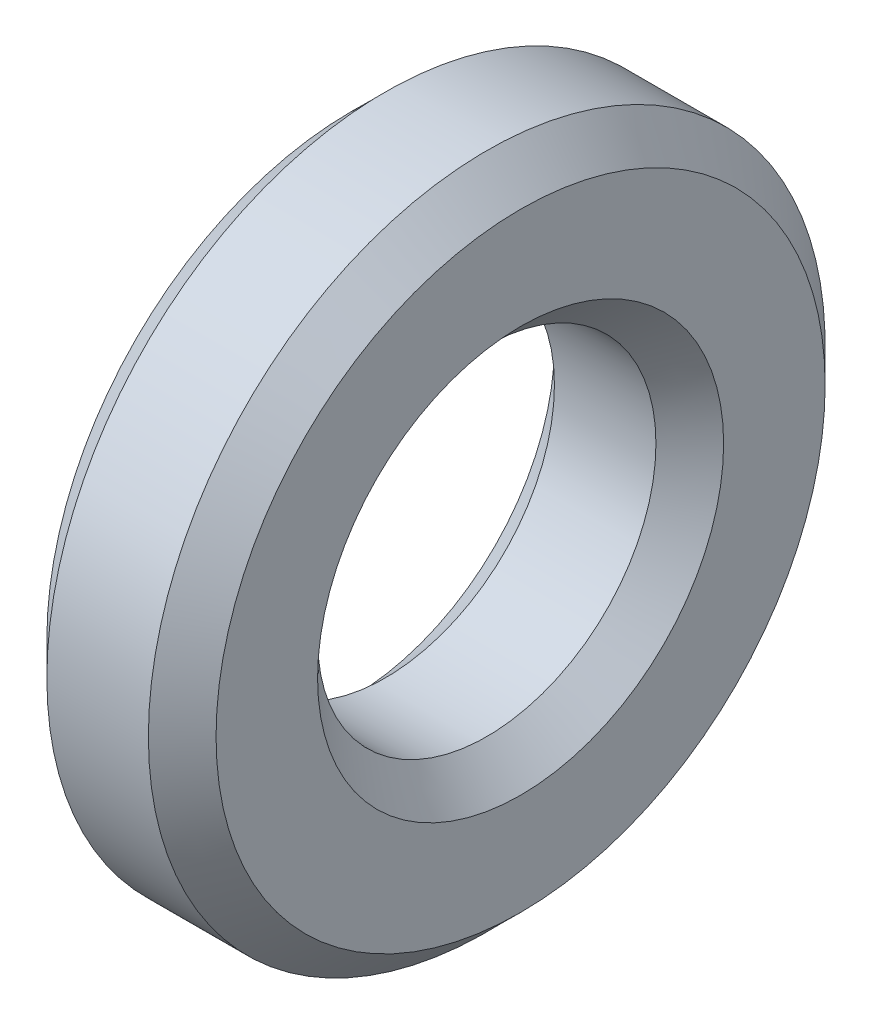
ISO-10303-21;
HEADER;
FILE_DESCRIPTION(('STEP AP214'),'2;1');
FILE_NAME('part.step','',(''),(''),'','','');
FILE_SCHEMA(('AUTOMOTIVE_DESIGN { 1 0 10303 214 1 1 1 1 }'));
ENDSEC;
DATA;
#1=APPLICATION_CONTEXT('core data for automotive mechanical design processes');
#2=APPLICATION_PROTOCOL_DEFINITION('international standard','automotive_design',2000,#1);
#3=PRODUCT_CONTEXT('',#1,'mechanical');
#4=PRODUCT('Part','Part','',(#3));
#5=PRODUCT_RELATED_PRODUCT_CATEGORY('part','',(#4));
#6=PRODUCT_DEFINITION_FORMATION('','',#4);
#7=PRODUCT_DEFINITION_CONTEXT('part definition',#1,'design');
#8=PRODUCT_DEFINITION('design','',#6,#7);
#9=PRODUCT_DEFINITION_SHAPE('','',#8);
#10=(LENGTH_UNIT() NAMED_UNIT(*) SI_UNIT(.MILLI.,.METRE.));
#11=(NAMED_UNIT(*) PLANE_ANGLE_UNIT() SI_UNIT($,.RADIAN.));
#12=(NAMED_UNIT(*) SI_UNIT($,.STERADIAN.) SOLID_ANGLE_UNIT());
#13=UNCERTAINTY_MEASURE_WITH_UNIT(LENGTH_MEASURE(1.E-05),#10,'distance_accuracy_value','');
#14=(GEOMETRIC_REPRESENTATION_CONTEXT(3) GLOBAL_UNCERTAINTY_ASSIGNED_CONTEXT((#13)) GLOBAL_UNIT_ASSIGNED_CONTEXT((#10,
#11,#12)) REPRESENTATION_CONTEXT('',''));
#15=CARTESIAN_POINT('',(0.,0.,0.));
#16=DIRECTION('',(0.,0.,1.));
#17=DIRECTION('',(1.,0.,0.));
#18=AXIS2_PLACEMENT_3D('',#15,#16,#17);
#19=CARTESIAN_POINT('',(0.,1.,0.));
#20=DIRECTION('',(1.,0.,0.));
#21=DIRECTION('',(0.,0.,-1.));
#22=AXIS2_PLACEMENT_3D('',#19,#20,#21);
#23=PLANE('',#22);
#24=CARTESIAN_POINT('',(0.,0.,0.));
#25=DIRECTION('',(1.,0.,0.));
#26=DIRECTION('',(0.,0.,-1.));
#27=AXIS2_PLACEMENT_3D('',#24,#25,#26);
#28=CIRCLE('',#27,1.2);
#29=CARTESIAN_POINT('',(0.,0.,-1.2));
#30=VERTEX_POINT('',#29);
#31=EDGE_CURVE('E54',#30,#30,#28,.T.);
#32=ORIENTED_EDGE('',*,*,#31,.T.);
#33=EDGE_LOOP('',(#32));
#34=FACE_BOUND('',#33,.T.);
#35=CARTESIAN_POINT('',(0.,0.,0.));
#36=DIRECTION('',(1.,0.,0.));
#37=DIRECTION('',(0.,0.,-1.));
#38=AXIS2_PLACEMENT_3D('',#35,#36,#37);
#39=CIRCLE('',#38,1.8);
#40=CARTESIAN_POINT('',(0.,0.,-1.8));
#41=VERTEX_POINT('',#40);
#42=EDGE_CURVE('E57',#41,#41,#39,.F.);
#43=ORIENTED_EDGE('',*,*,#42,.T.);
#44=EDGE_LOOP('',(#43));
#45=FACE_BOUND('',#44,.T.);
#46=ADVANCED_FACE('F34',(#34,#45),#23,.F.);
#47=CARTESIAN_POINT('',(0.,0.,0.));
#48=DIRECTION('',(-1.,0.,0.));
#49=DIRECTION('',(0.,0.,1.));
#50=AXIS2_PLACEMENT_3D('',#47,#48,#49);
#51=CYLINDRICAL_SURFACE('',#50,2.);
#52=CARTESIAN_POINT('',(0.200000000000001,0.,0.));
#53=DIRECTION('',(1.,0.,0.));
#54=DIRECTION('',(0.,0.,-1.));
#55=AXIS2_PLACEMENT_3D('',#52,#53,#54);
#56=CIRCLE('',#55,2.);
#57=CARTESIAN_POINT('',(0.200000000000001,0.,-2.));
#58=VERTEX_POINT('',#57);
#59=EDGE_CURVE('E45',#58,#58,#56,.T.);
#60=ORIENTED_EDGE('',*,*,#59,.T.);
#61=EDGE_LOOP('',(#60));
#62=FACE_BOUND('',#61,.T.);
#63=CARTESIAN_POINT('',(0.8,0.,0.));
#64=DIRECTION('',(-1.,0.,0.));
#65=DIRECTION('',(0.,0.,1.));
#66=AXIS2_PLACEMENT_3D('',#63,#64,#65);
#67=CIRCLE('',#66,2.);
#68=CARTESIAN_POINT('',(0.8,0.,2.));
#69=VERTEX_POINT('',#68);
#70=EDGE_CURVE('E49',#69,#69,#67,.T.);
#71=ORIENTED_EDGE('',*,*,#70,.T.);
#72=EDGE_LOOP('',(#71));
#73=FACE_BOUND('',#72,.T.);
#74=ADVANCED_FACE('F82',(#62,#73),#51,.T.);
#75=CARTESIAN_POINT('',(1.,1.,0.));
#76=DIRECTION('',(-1.,0.,0.));
#77=DIRECTION('',(0.,0.,1.));
#78=AXIS2_PLACEMENT_3D('',#75,#76,#77);
#79=PLANE('',#78);
#80=CARTESIAN_POINT('',(1.,0.,0.));
#81=DIRECTION('',(-1.,0.,0.));
#82=DIRECTION('',(0.,0.,1.));
#83=AXIS2_PLACEMENT_3D('',#80,#81,#82);
#84=CIRCLE('',#83,1.2);
#85=CARTESIAN_POINT('',(1.,0.,1.2));
#86=VERTEX_POINT('',#85);
#87=EDGE_CURVE('E10',#86,#86,#84,.T.);
#88=ORIENTED_EDGE('',*,*,#87,.T.);
#89=EDGE_LOOP('',(#88));
#90=FACE_BOUND('',#89,.T.);
#91=CARTESIAN_POINT('',(1.,0.,0.));
#92=DIRECTION('',(-1.,0.,0.));
#93=DIRECTION('',(0.,0.,1.));
#94=AXIS2_PLACEMENT_3D('',#91,#92,#93);
#95=CIRCLE('',#94,1.8);
#96=CARTESIAN_POINT('',(1.,0.,1.8));
#97=VERTEX_POINT('',#96);
#98=EDGE_CURVE('E41',#97,#97,#95,.F.);
#99=ORIENTED_EDGE('',*,*,#98,.T.);
#100=EDGE_LOOP('',(#99));
#101=FACE_BOUND('',#100,.T.);
#102=ADVANCED_FACE('F88',(#90,#101),#79,.F.);
#103=CARTESIAN_POINT('',(0.,0.,0.));
#104=DIRECTION('',(-1.,0.,0.));
#105=DIRECTION('',(0.,0.,1.));
#106=AXIS2_PLACEMENT_3D('',#103,#104,#105);
#107=CYLINDRICAL_SURFACE('',#106,1.);
#108=CARTESIAN_POINT('',(0.200000000000002,0.,0.));
#109=DIRECTION('',(1.,0.,0.));
#110=DIRECTION('',(0.,0.,-1.));
#111=AXIS2_PLACEMENT_3D('',#108,#109,#110);
#112=CIRCLE('',#111,1.);
#113=CARTESIAN_POINT('',(0.200000000000002,0.,-1.));
#114=VERTEX_POINT('',#113);
#115=EDGE_CURVE('E60',#114,#114,#112,.F.);
#116=ORIENTED_EDGE('',*,*,#115,.T.);
#117=EDGE_LOOP('',(#116));
#118=FACE_BOUND('',#117,.T.);
#119=CARTESIAN_POINT('',(0.799999999999999,0.,0.));
#120=DIRECTION('',(-1.,0.,0.));
#121=DIRECTION('',(0.,0.,1.));
#122=AXIS2_PLACEMENT_3D('',#119,#120,#121);
#123=CIRCLE('',#122,1.);
#124=CARTESIAN_POINT('',(0.799999999999999,0.,1.));
#125=VERTEX_POINT('',#124);
#126=EDGE_CURVE('E63',#125,#125,#123,.F.);
#127=ORIENTED_EDGE('',*,*,#126,.T.);
#128=EDGE_LOOP('',(#127));
#129=FACE_BOUND('',#128,.T.);
#130=ADVANCED_FACE('F67',(#118,#129),#107,.F.);
#131=CARTESIAN_POINT('',(0.200000000000002,0.,0.));
#132=DIRECTION('',(-1.,0.,0.));
#133=DIRECTION('',(0.,0.,1.));
#134=AXIS2_PLACEMENT_3D('',#131,#132,#133);
#135=CONICAL_SURFACE('',#134,1.,0.785398163397448);
#136=ORIENTED_EDGE('',*,*,#31,.F.);
#137=EDGE_LOOP('',(#136));
#138=FACE_BOUND('',#137,.T.);
#139=ORIENTED_EDGE('',*,*,#115,.F.);
#140=EDGE_LOOP('',(#139));
#141=FACE_BOUND('',#140,.T.);
#142=ADVANCED_FACE('F78',(#138,#141),#135,.F.);
#143=CARTESIAN_POINT('',(0.,0.,0.));
#144=DIRECTION('',(1.,0.,0.));
#145=DIRECTION('',(0.,0.,-1.));
#146=AXIS2_PLACEMENT_3D('',#143,#144,#145);
#147=CONICAL_SURFACE('',#146,1.8,0.785398163397446);
#148=ORIENTED_EDGE('',*,*,#59,.F.);
#149=EDGE_LOOP('',(#148));
#150=FACE_BOUND('',#149,.T.);
#151=ORIENTED_EDGE('',*,*,#42,.F.);
#152=EDGE_LOOP('',(#151));
#153=FACE_BOUND('',#152,.T.);
#154=ADVANCED_FACE('F72',(#150,#153),#147,.T.);
#155=CARTESIAN_POINT('',(1.,0.,0.));
#156=DIRECTION('',(1.,0.,0.));
#157=DIRECTION('',(0.,0.,-1.));
#158=AXIS2_PLACEMENT_3D('',#155,#156,#157);
#159=CONICAL_SURFACE('',#158,1.2,0.785398163397445);
#160=ORIENTED_EDGE('',*,*,#126,.F.);
#161=EDGE_LOOP('',(#160));
#162=FACE_BOUND('',#161,.T.);
#163=ORIENTED_EDGE('',*,*,#87,.F.);
#164=EDGE_LOOP('',(#163));
#165=FACE_BOUND('',#164,.T.);
#166=ADVANCED_FACE('F69',(#162,#165),#159,.F.);
#167=CARTESIAN_POINT('',(0.8,0.,0.));
#168=DIRECTION('',(-1.,0.,0.));
#169=DIRECTION('',(0.,0.,1.));
#170=AXIS2_PLACEMENT_3D('',#167,#168,#169);
#171=CONICAL_SURFACE('',#170,2.,0.785398163397451);
#172=CARTESIAN_POINT('',(1.,0.,1.8));
#173=CARTESIAN_POINT('',(0.997916666666667,0.,1.80208333333333));
#174=CARTESIAN_POINT('',(0.995833333333334,0.,1.80416666666667));
#175=CARTESIAN_POINT('',(0.991666666666667,0.,1.80833333333333));
#176=CARTESIAN_POINT('',(0.989583333333333,0.,1.81041666666667));
#177=CARTESIAN_POINT('',(0.985416666666667,0.,1.81458333333333));
#178=CARTESIAN_POINT('',(0.983333333333334,0.,1.81666666666667));
#179=CARTESIAN_POINT('',(0.979166666666667,0.,1.82083333333333));
#180=CARTESIAN_POINT('',(0.977083333333334,0.,1.82291666666667));
#181=CARTESIAN_POINT('',(0.972916666666667,0.,1.82708333333333));
#182=CARTESIAN_POINT('',(0.970833333333334,0.,1.82916666666667));
#183=CARTESIAN_POINT('',(0.966666666666667,0.,1.83333333333333));
#184=CARTESIAN_POINT('',(0.964583333333334,0.,1.83541666666667));
#185=CARTESIAN_POINT('',(0.960416666666667,0.,1.83958333333333));
#186=CARTESIAN_POINT('',(0.958333333333333,0.,1.84166666666667));
#187=CARTESIAN_POINT('',(0.954166666666667,0.,1.84583333333333));
#188=CARTESIAN_POINT('',(0.952083333333334,0.,1.84791666666667));
#189=CARTESIAN_POINT('',(0.947916666666667,0.,1.85208333333333));
#190=CARTESIAN_POINT('',(0.945833333333334,0.,1.85416666666667));
#191=CARTESIAN_POINT('',(0.941666666666667,0.,1.85833333333333));
#192=CARTESIAN_POINT('',(0.939583333333334,0.,1.86041666666667));
#193=CARTESIAN_POINT('',(0.935416666666667,0.,1.86458333333333));
#194=CARTESIAN_POINT('',(0.933333333333334,0.,1.86666666666667));
#195=CARTESIAN_POINT('',(0.929166666666667,0.,1.87083333333333));
#196=CARTESIAN_POINT('',(0.927083333333334,0.,1.87291666666667));
#197=CARTESIAN_POINT('',(0.922916666666667,0.,1.87708333333333));
#198=CARTESIAN_POINT('',(0.920833333333334,0.,1.87916666666667));
#199=CARTESIAN_POINT('',(0.916666666666667,0.,1.88333333333333));
#200=CARTESIAN_POINT('',(0.914583333333334,0.,1.88541666666667));
#201=CARTESIAN_POINT('',(0.910416666666667,0.,1.88958333333333));
#202=CARTESIAN_POINT('',(0.908333333333334,0.,1.89166666666667));
#203=CARTESIAN_POINT('',(0.904166666666667,0.,1.89583333333333));
#204=CARTESIAN_POINT('',(0.902083333333334,0.,1.89791666666667));
#205=CARTESIAN_POINT('',(0.897916666666667,0.,1.90208333333333));
#206=CARTESIAN_POINT('',(0.895833333333334,0.,1.90416666666667));
#207=CARTESIAN_POINT('',(0.891666666666667,0.,1.90833333333333));
#208=CARTESIAN_POINT('',(0.889583333333334,0.,1.91041666666667));
#209=CARTESIAN_POINT('',(0.885416666666667,0.,1.91458333333333));
#210=CARTESIAN_POINT('',(0.883333333333334,0.,1.91666666666667));
#211=CARTESIAN_POINT('',(0.879166666666667,0.,1.92083333333333));
#212=CARTESIAN_POINT('',(0.877083333333334,0.,1.92291666666667));
#213=CARTESIAN_POINT('',(0.872916666666667,0.,1.92708333333333));
#214=CARTESIAN_POINT('',(0.870833333333334,0.,1.92916666666667));
#215=CARTESIAN_POINT('',(0.866666666666667,0.,1.93333333333333));
#216=CARTESIAN_POINT('',(0.864583333333334,0.,1.93541666666667));
#217=CARTESIAN_POINT('',(0.860416666666667,0.,1.93958333333333));
#218=CARTESIAN_POINT('',(0.858333333333334,0.,1.94166666666667));
#219=CARTESIAN_POINT('',(0.854166666666667,0.,1.94583333333333));
#220=CARTESIAN_POINT('',(0.852083333333334,0.,1.94791666666667));
#221=CARTESIAN_POINT('',(0.847916666666667,0.,1.95208333333333));
#222=CARTESIAN_POINT('',(0.845833333333334,0.,1.95416666666667));
#223=CARTESIAN_POINT('',(0.841666666666667,0.,1.95833333333333));
#224=CARTESIAN_POINT('',(0.839583333333334,0.,1.96041666666667));
#225=CARTESIAN_POINT('',(0.835416666666667,0.,1.96458333333333));
#226=CARTESIAN_POINT('',(0.833333333333334,0.,1.96666666666667));
#227=CARTESIAN_POINT('',(0.829166666666667,0.,1.97083333333333));
#228=CARTESIAN_POINT('',(0.827083333333334,0.,1.97291666666667));
#229=CARTESIAN_POINT('',(0.822916666666667,0.,1.97708333333333));
#230=CARTESIAN_POINT('',(0.820833333333334,0.,1.97916666666667));
#231=CARTESIAN_POINT('',(0.816666666666667,0.,1.98333333333333));
#232=CARTESIAN_POINT('',(0.814583333333334,0.,1.98541666666667));
#233=CARTESIAN_POINT('',(0.810416666666667,0.,1.98958333333333));
#234=CARTESIAN_POINT('',(0.808333333333334,0.,1.99166666666667));
#235=CARTESIAN_POINT('',(0.804166666666667,0.,1.99583333333333));
#236=CARTESIAN_POINT('',(0.802083333333334,0.,1.99791666666667));
#237=CARTESIAN_POINT('',(0.8,0.,2.));
#238=B_SPLINE_CURVE_WITH_KNOTS('',3,(#172,#173,#174,#175,#176,#177,#178,#179,#180,#181,#182,
#183,#184,#185,#186,#187,#188,#189,#190,#191,#192,#193,#194,#195,#196,#197,#198,#199,#200,#201,
#202,#203,#204,#205,#206,#207,#208,#209,#210,#211,#212,#213,#214,#215,#216,#217,#218,#219,#220,
#221,#222,#223,#224,#225,#226,#227,#228,#229,#230,#231,#232,#233,#234,#235,#236,#237),
.UNSPECIFIED.,.F.,.F.,(4,2,2,2,2,2,2,2,2,2,2,2,2,2,2,2,2,2,2,2,2,2,2,2,2,2,2,2,2,2,2,2,4),(0.,
0.00883883476483194,0.0176776695296639,0.0265165042944957,0.0353553390593275,0.0441941738241594,
0.0530330085889912,0.0618718433538232,0.070710678118655,0.0795495128834868,0.0883883476483187,
0.0972271824131506,0.106066017177982,0.114904851942814,0.123743686707646,0.132582521472478,
0.14142135623731,0.150260191002142,0.159099025766974,0.167937860531805,0.176776695296637,
0.185615530061469,0.194454364826301,0.203293199591133,0.212132034355965,0.220970869120797,
0.229809703885629,0.23864853865046,0.247487373415292,0.256326208180124,0.265165042944956,
0.274003877709788,0.28284271247462),.UNSPECIFIED.);
#239=EDGE_CURVE('BSEAM36',#97,#69,#238,.T.);
#240=ORIENTED_EDGE('',*,*,#98,.F.);
#241=ORIENTED_EDGE('',*,*,#70,.F.);
#242=ORIENTED_EDGE('',*,*,#239,.T.);
#243=ORIENTED_EDGE('',*,*,#239,.F.);
#244=EDGE_LOOP('',(#240,#242,#241,#243));
#245=FACE_BOUND('',#244,.T.);
#246=ADVANCED_FACE('F36',(#245),#171,.T.);
#247=CLOSED_SHELL('',(#46,#74,#102,#130,#142,#154,#166,#246));
#248=MANIFOLD_SOLID_BREP('B2',#247);
#249=ADVANCED_BREP_SHAPE_REPRESENTATION('',(#18,#248),#14);
#250=SHAPE_DEFINITION_REPRESENTATION(#9,#249);
ENDSEC;
END-ISO-10303-21;
